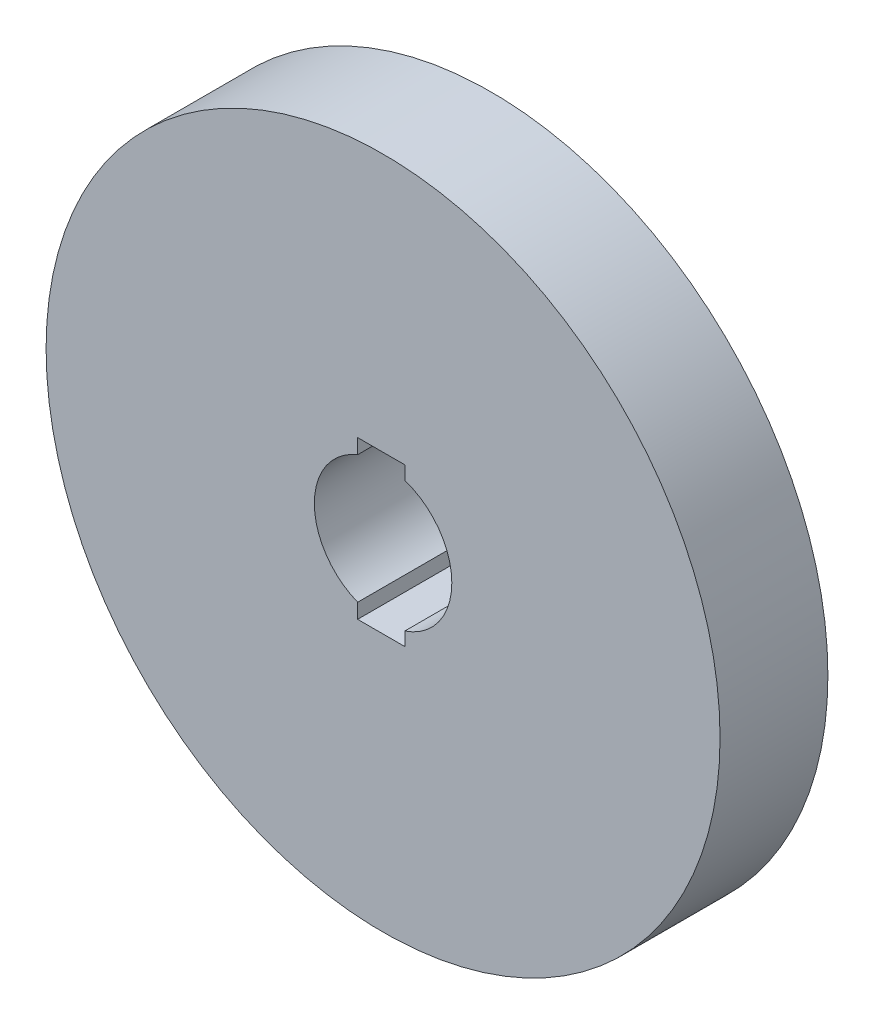
ISO-10303-21;
HEADER;
FILE_DESCRIPTION(('STEP AP214'),'2;1');
FILE_NAME('part.step','',(''),(''),'','','');
FILE_SCHEMA(('AUTOMOTIVE_DESIGN { 1 0 10303 214 1 1 1 1 }'));
ENDSEC;
DATA;
#1=APPLICATION_CONTEXT('core data for automotive mechanical design processes');
#2=APPLICATION_PROTOCOL_DEFINITION('international standard','automotive_design',2000,#1);
#3=PRODUCT_CONTEXT('',#1,'mechanical');
#4=PRODUCT('Part','Part','',(#3));
#5=PRODUCT_RELATED_PRODUCT_CATEGORY('part','',(#4));
#6=PRODUCT_DEFINITION_FORMATION('','',#4);
#7=PRODUCT_DEFINITION_CONTEXT('part definition',#1,'design');
#8=PRODUCT_DEFINITION('design','',#6,#7);
#9=PRODUCT_DEFINITION_SHAPE('','',#8);
#10=(LENGTH_UNIT() NAMED_UNIT(*) SI_UNIT(.MILLI.,.METRE.));
#11=(NAMED_UNIT(*) PLANE_ANGLE_UNIT() SI_UNIT($,.RADIAN.));
#12=(NAMED_UNIT(*) SI_UNIT($,.STERADIAN.) SOLID_ANGLE_UNIT());
#13=UNCERTAINTY_MEASURE_WITH_UNIT(LENGTH_MEASURE(1.E-05),#10,'distance_accuracy_value','');
#14=(GEOMETRIC_REPRESENTATION_CONTEXT(3) GLOBAL_UNCERTAINTY_ASSIGNED_CONTEXT((#13)) GLOBAL_UNIT_ASSIGNED_CONTEXT((#10,
#11,#12)) REPRESENTATION_CONTEXT('',''));
#15=CARTESIAN_POINT('',(0.,0.,0.));
#16=DIRECTION('',(0.,0.,1.));
#17=DIRECTION('',(1.,0.,0.));
#18=AXIS2_PLACEMENT_3D('',#15,#16,#17);
#19=CARTESIAN_POINT('',(0.,0.,8.));
#20=DIRECTION('',(0.,0.,-1.));
#21=DIRECTION('',(-1.,0.,0.));
#22=AXIS2_PLACEMENT_3D('',#19,#20,#21);
#23=CYLINDRICAL_SURFACE('',#22,25.);
#24=CARTESIAN_POINT('',(0.,0.,8.));
#25=DIRECTION('',(0.,0.,1.));
#26=DIRECTION('',(1.,0.,0.));
#27=AXIS2_PLACEMENT_3D('',#24,#25,#26);
#28=CIRCLE('',#27,25.);
#29=CARTESIAN_POINT('',(25.,0.,8.));
#30=VERTEX_POINT('',#29);
#31=EDGE_CURVE('E11',#30,#30,#28,.T.);
#32=ORIENTED_EDGE('',*,*,#31,.F.);
#33=EDGE_LOOP('',(#32));
#34=FACE_BOUND('',#33,.T.);
#35=CARTESIAN_POINT('',(0.,0.,0.));
#36=DIRECTION('',(0.,0.,1.));
#37=DIRECTION('',(1.,0.,0.));
#38=AXIS2_PLACEMENT_3D('',#35,#36,#37);
#39=CIRCLE('',#38,25.);
#40=CARTESIAN_POINT('',(25.,0.,0.));
#41=VERTEX_POINT('',#40);
#42=EDGE_CURVE('E48',#41,#41,#39,.T.);
#43=ORIENTED_EDGE('',*,*,#42,.T.);
#44=EDGE_LOOP('',(#43));
#45=FACE_BOUND('',#44,.T.);
#46=ADVANCED_FACE('F45',(#34,#45),#23,.T.);
#47=CARTESIAN_POINT('',(0.,0.,8.));
#48=DIRECTION('',(0.,0.,1.));
#49=DIRECTION('',(1.,0.,0.));
#50=AXIS2_PLACEMENT_3D('',#47,#48,#49);
#51=PLANE('',#50);
#52=DIRECTION('',(0.,1.,0.));
#53=VECTOR('',#52,1.);
#54=CARTESIAN_POINT('',(1.61259366911181,4.8383407960106,8.));
#55=LINE('',#54,#53);
#56=CARTESIAN_POINT('',(1.61259366911181,4.8383407960106,8.));
#57=VERTEX_POINT('',#56);
#58=CARTESIAN_POINT('',(1.61259366911181,5.8383407960106,8.));
#59=VERTEX_POINT('',#58);
#60=EDGE_CURVE('E60',#57,#59,#55,.T.);
#61=ORIENTED_EDGE('',*,*,#60,.F.);
#62=CARTESIAN_POINT('',(0.,0.,8.));
#63=DIRECTION('',(0.,0.,1.));
#64=DIRECTION('',(1.,0.,0.));
#65=AXIS2_PLACEMENT_3D('',#62,#63,#64);
#66=CIRCLE('',#65,5.1);
#67=CARTESIAN_POINT('',(1.61259366911181,-4.8383407960106,8.));
#68=VERTEX_POINT('',#67);
#69=EDGE_CURVE('E132',#68,#57,#66,.T.);
#70=ORIENTED_EDGE('',*,*,#69,.F.);
#71=DIRECTION('',(0.,1.,0.));
#72=VECTOR('',#71,1.);
#73=CARTESIAN_POINT('',(1.61259366911181,-5.8383407960106,8.));
#74=LINE('',#73,#72);
#75=CARTESIAN_POINT('',(1.61259366911181,-5.8383407960106,8.));
#76=VERTEX_POINT('',#75);
#77=EDGE_CURVE('E136',#76,#68,#74,.T.);
#78=ORIENTED_EDGE('',*,*,#77,.F.);
#79=DIRECTION('',(1.,0.,0.));
#80=VECTOR('',#79,1.);
#81=CARTESIAN_POINT('',(-1.88629968479603,-5.8383407960106,8.));
#82=LINE('',#81,#80);
#83=CARTESIAN_POINT('',(-1.88629968479603,-5.8383407960106,8.));
#84=VERTEX_POINT('',#83);
#85=EDGE_CURVE('E175',#84,#76,#82,.T.);
#86=ORIENTED_EDGE('',*,*,#85,.F.);
#87=DIRECTION('',(0.,-1.,0.));
#88=VECTOR('',#87,1.);
#89=CARTESIAN_POINT('',(-1.88629968479603,-5.8383407960106,8.));
#90=LINE('',#89,#88);
#91=CARTESIAN_POINT('',(-1.88629968479603,-4.7383407960106,8.));
#92=VERTEX_POINT('',#91);
#93=EDGE_CURVE('E171',#92,#84,#90,.T.);
#94=ORIENTED_EDGE('',*,*,#93,.F.);
#95=CARTESIAN_POINT('',(0.,0.,8.));
#96=DIRECTION('',(0.,0.,1.));
#97=DIRECTION('',(1.,0.,0.));
#98=AXIS2_PLACEMENT_3D('',#95,#96,#97);
#99=CIRCLE('',#98,5.1);
#100=CARTESIAN_POINT('',(-1.88629968479603,4.7383407960106,8.));
#101=VERTEX_POINT('',#100);
#102=EDGE_CURVE('E167',#101,#92,#99,.T.);
#103=ORIENTED_EDGE('',*,*,#102,.F.);
#104=DIRECTION('',(0.,-1.,0.));
#105=VECTOR('',#104,1.);
#106=CARTESIAN_POINT('',(-1.88629968479603,4.7383407960106,8.));
#107=LINE('',#106,#105);
#108=CARTESIAN_POINT('',(-1.88629968479603,5.8383407960106,8.));
#109=VERTEX_POINT('',#108);
#110=EDGE_CURVE('E163',#109,#101,#107,.T.);
#111=ORIENTED_EDGE('',*,*,#110,.F.);
#112=DIRECTION('',(-1.,0.,0.));
#113=VECTOR('',#112,1.);
#114=CARTESIAN_POINT('',(-1.88629968479603,5.8383407960106,8.));
#115=LINE('',#114,#113);
#116=EDGE_CURVE('E160',#59,#109,#115,.T.);
#117=ORIENTED_EDGE('',*,*,#116,.F.);
#118=EDGE_LOOP('',(#61,#70,#78,#86,#94,#103,#111,#117));
#119=FACE_BOUND('',#118,.T.);
#120=ORIENTED_EDGE('',*,*,#31,.T.);
#121=EDGE_LOOP('',(#120));
#122=FACE_BOUND('',#121,.T.);
#123=ADVANCED_FACE('F205',(#119,#122),#51,.T.);
#124=CARTESIAN_POINT('',(0.,0.,0.));
#125=DIRECTION('',(0.,0.,1.));
#126=DIRECTION('',(1.,0.,0.));
#127=AXIS2_PLACEMENT_3D('',#124,#125,#126);
#128=PLANE('',#127);
#129=CARTESIAN_POINT('',(0.,0.,0.));
#130=DIRECTION('',(0.,0.,1.));
#131=DIRECTION('',(1.,0.,0.));
#132=AXIS2_PLACEMENT_3D('',#129,#130,#131);
#133=CIRCLE('',#132,5.1);
#134=CARTESIAN_POINT('',(1.61259366911181,-4.8383407960106,0.));
#135=VERTEX_POINT('',#134);
#136=CARTESIAN_POINT('',(1.61259366911181,4.8383407960106,0.));
#137=VERTEX_POINT('',#136);
#138=EDGE_CURVE('E119',#135,#137,#133,.T.);
#139=ORIENTED_EDGE('',*,*,#138,.T.);
#140=DIRECTION('',(0.,1.,0.));
#141=VECTOR('',#140,1.);
#142=CARTESIAN_POINT('',(1.61259366911181,4.8383407960106,0.));
#143=LINE('',#142,#141);
#144=CARTESIAN_POINT('',(1.61259366911181,5.8383407960106,0.));
#145=VERTEX_POINT('',#144);
#146=EDGE_CURVE('E112',#137,#145,#143,.T.);
#147=ORIENTED_EDGE('',*,*,#146,.T.);
#148=DIRECTION('',(-1.,0.,0.));
#149=VECTOR('',#148,1.);
#150=CARTESIAN_POINT('',(-1.88629968479603,5.8383407960106,0.));
#151=LINE('',#150,#149);
#152=CARTESIAN_POINT('',(-1.88629968479603,5.8383407960106,0.));
#153=VERTEX_POINT('',#152);
#154=EDGE_CURVE('E122',#145,#153,#151,.T.);
#155=ORIENTED_EDGE('',*,*,#154,.T.);
#156=DIRECTION('',(0.,-1.,0.));
#157=VECTOR('',#156,1.);
#158=CARTESIAN_POINT('',(-1.88629968479603,4.7383407960106,0.));
#159=LINE('',#158,#157);
#160=CARTESIAN_POINT('',(-1.88629968479603,4.7383407960106,0.));
#161=VERTEX_POINT('',#160);
#162=EDGE_CURVE('E68',#153,#161,#159,.T.);
#163=ORIENTED_EDGE('',*,*,#162,.T.);
#164=CARTESIAN_POINT('',(0.,0.,0.));
#165=DIRECTION('',(0.,0.,1.));
#166=DIRECTION('',(1.,0.,0.));
#167=AXIS2_PLACEMENT_3D('',#164,#165,#166);
#168=CIRCLE('',#167,5.1);
#169=CARTESIAN_POINT('',(-1.88629968479603,-4.7383407960106,0.));
#170=VERTEX_POINT('',#169);
#171=EDGE_CURVE('E141',#161,#170,#168,.T.);
#172=ORIENTED_EDGE('',*,*,#171,.T.);
#173=DIRECTION('',(0.,-1.,0.));
#174=VECTOR('',#173,1.);
#175=CARTESIAN_POINT('',(-1.88629968479603,-5.8383407960106,0.));
#176=LINE('',#175,#174);
#177=CARTESIAN_POINT('',(-1.88629968479603,-5.8383407960106,0.));
#178=VERTEX_POINT('',#177);
#179=EDGE_CURVE('E145',#170,#178,#176,.T.);
#180=ORIENTED_EDGE('',*,*,#179,.T.);
#181=DIRECTION('',(1.,0.,0.));
#182=VECTOR('',#181,1.);
#183=CARTESIAN_POINT('',(-1.88629968479603,-5.8383407960106,0.));
#184=LINE('',#183,#182);
#185=CARTESIAN_POINT('',(1.61259366911181,-5.8383407960106,0.));
#186=VERTEX_POINT('',#185);
#187=EDGE_CURVE('E149',#178,#186,#184,.T.);
#188=ORIENTED_EDGE('',*,*,#187,.T.);
#189=DIRECTION('',(0.,1.,0.));
#190=VECTOR('',#189,1.);
#191=CARTESIAN_POINT('',(1.61259366911181,-5.8383407960106,0.));
#192=LINE('',#191,#190);
#193=EDGE_CURVE('E153',#186,#135,#192,.T.);
#194=ORIENTED_EDGE('',*,*,#193,.T.);
#195=EDGE_LOOP('',(#139,#147,#155,#163,#172,#180,#188,#194));
#196=FACE_BOUND('',#195,.T.);
#197=ORIENTED_EDGE('',*,*,#42,.F.);
#198=EDGE_LOOP('',(#197));
#199=FACE_BOUND('',#198,.T.);
#200=ADVANCED_FACE('F127',(#196,#199),#128,.F.);
#201=CARTESIAN_POINT('',(1.61259366911181,4.8383407960106,0.));
#202=DIRECTION('',(1.,0.,0.));
#203=DIRECTION('',(0.,0.,-1.));
#204=AXIS2_PLACEMENT_3D('',#201,#202,#203);
#205=PLANE('',#204);
#206=ORIENTED_EDGE('',*,*,#60,.T.);
#207=DIRECTION('',(0.,0.,1.));
#208=VECTOR('',#207,1.);
#209=CARTESIAN_POINT('',(1.61259366911181,5.8383407960106,0.));
#210=LINE('',#209,#208);
#211=EDGE_CURVE('E108',#145,#59,#210,.T.);
#212=ORIENTED_EDGE('',*,*,#211,.F.);
#213=ORIENTED_EDGE('',*,*,#146,.F.);
#214=DIRECTION('',(0.,0.,1.));
#215=VECTOR('',#214,1.);
#216=CARTESIAN_POINT('',(1.61259366911181,4.8383407960106,0.));
#217=LINE('',#216,#215);
#218=EDGE_CURVE('E182',#137,#57,#217,.T.);
#219=ORIENTED_EDGE('',*,*,#218,.T.);
#220=EDGE_LOOP('',(#206,#212,#213,#219));
#221=FACE_BOUND('',#220,.T.);
#222=ADVANCED_FACE('F110',(#221),#205,.F.);
#223=CARTESIAN_POINT('',(0.,0.,0.));
#224=DIRECTION('',(0.,0.,1.));
#225=DIRECTION('',(1.,0.,0.));
#226=AXIS2_PLACEMENT_3D('',#223,#224,#225);
#227=CYLINDRICAL_SURFACE('',#226,5.1);
#228=ORIENTED_EDGE('',*,*,#69,.T.);
#229=ORIENTED_EDGE('',*,*,#218,.F.);
#230=ORIENTED_EDGE('',*,*,#138,.F.);
#231=DIRECTION('',(0.,0.,1.));
#232=VECTOR('',#231,1.);
#233=CARTESIAN_POINT('',(1.61259366911181,-4.8383407960106,0.));
#234=LINE('',#233,#232);
#235=EDGE_CURVE('E185',#135,#68,#234,.T.);
#236=ORIENTED_EDGE('',*,*,#235,.T.);
#237=EDGE_LOOP('',(#228,#229,#230,#236));
#238=FACE_BOUND('',#237,.T.);
#239=ADVANCED_FACE('F224',(#238),#227,.F.);
#240=CARTESIAN_POINT('',(1.61259366911181,-5.8383407960106,0.));
#241=DIRECTION('',(1.,0.,0.));
#242=DIRECTION('',(0.,0.,-1.));
#243=AXIS2_PLACEMENT_3D('',#240,#241,#242);
#244=PLANE('',#243);
#245=ORIENTED_EDGE('',*,*,#77,.T.);
#246=ORIENTED_EDGE('',*,*,#235,.F.);
#247=ORIENTED_EDGE('',*,*,#193,.F.);
#248=DIRECTION('',(0.,0.,1.));
#249=VECTOR('',#248,1.);
#250=CARTESIAN_POINT('',(1.61259366911181,-5.8383407960106,0.));
#251=LINE('',#250,#249);
#252=EDGE_CURVE('E188',#186,#76,#251,.T.);
#253=ORIENTED_EDGE('',*,*,#252,.T.);
#254=EDGE_LOOP('',(#245,#246,#247,#253));
#255=FACE_BOUND('',#254,.T.);
#256=ADVANCED_FACE('F221',(#255),#244,.F.);
#257=CARTESIAN_POINT('',(-1.88629968479603,-5.8383407960106,0.));
#258=DIRECTION('',(0.,-1.,0.));
#259=DIRECTION('',(0.,0.,-1.));
#260=AXIS2_PLACEMENT_3D('',#257,#258,#259);
#261=PLANE('',#260);
#262=ORIENTED_EDGE('',*,*,#85,.T.);
#263=ORIENTED_EDGE('',*,*,#252,.F.);
#264=ORIENTED_EDGE('',*,*,#187,.F.);
#265=DIRECTION('',(0.,0.,1.));
#266=VECTOR('',#265,1.);
#267=CARTESIAN_POINT('',(-1.88629968479603,-5.8383407960106,0.));
#268=LINE('',#267,#266);
#269=EDGE_CURVE('E191',#178,#84,#268,.T.);
#270=ORIENTED_EDGE('',*,*,#269,.T.);
#271=EDGE_LOOP('',(#262,#263,#264,#270));
#272=FACE_BOUND('',#271,.T.);
#273=ADVANCED_FACE('F217',(#272),#261,.F.);
#274=CARTESIAN_POINT('',(-1.88629968479603,-5.8383407960106,0.));
#275=DIRECTION('',(-1.,0.,0.));
#276=DIRECTION('',(0.,0.,1.));
#277=AXIS2_PLACEMENT_3D('',#274,#275,#276);
#278=PLANE('',#277);
#279=ORIENTED_EDGE('',*,*,#93,.T.);
#280=ORIENTED_EDGE('',*,*,#269,.F.);
#281=ORIENTED_EDGE('',*,*,#179,.F.);
#282=DIRECTION('',(0.,0.,1.));
#283=VECTOR('',#282,1.);
#284=CARTESIAN_POINT('',(-1.88629968479603,-4.7383407960106,0.));
#285=LINE('',#284,#283);
#286=EDGE_CURVE('E194',#170,#92,#285,.T.);
#287=ORIENTED_EDGE('',*,*,#286,.T.);
#288=EDGE_LOOP('',(#279,#280,#281,#287));
#289=FACE_BOUND('',#288,.T.);
#290=ADVANCED_FACE('F215',(#289),#278,.F.);
#291=CARTESIAN_POINT('',(0.,0.,0.));
#292=DIRECTION('',(0.,0.,1.));
#293=DIRECTION('',(1.,0.,0.));
#294=AXIS2_PLACEMENT_3D('',#291,#292,#293);
#295=CYLINDRICAL_SURFACE('',#294,5.1);
#296=ORIENTED_EDGE('',*,*,#102,.T.);
#297=ORIENTED_EDGE('',*,*,#286,.F.);
#298=ORIENTED_EDGE('',*,*,#171,.F.);
#299=DIRECTION('',(0.,0.,1.));
#300=VECTOR('',#299,1.);
#301=CARTESIAN_POINT('',(-1.88629968479603,4.7383407960106,0.));
#302=LINE('',#301,#300);
#303=EDGE_CURVE('E197',#161,#101,#302,.T.);
#304=ORIENTED_EDGE('',*,*,#303,.T.);
#305=EDGE_LOOP('',(#296,#297,#298,#304));
#306=FACE_BOUND('',#305,.T.);
#307=ADVANCED_FACE('F210',(#306),#295,.F.);
#308=CARTESIAN_POINT('',(-1.88629968479603,4.7383407960106,0.));
#309=DIRECTION('',(-1.,0.,0.));
#310=DIRECTION('',(0.,0.,1.));
#311=AXIS2_PLACEMENT_3D('',#308,#309,#310);
#312=PLANE('',#311);
#313=ORIENTED_EDGE('',*,*,#110,.T.);
#314=ORIENTED_EDGE('',*,*,#303,.F.);
#315=ORIENTED_EDGE('',*,*,#162,.F.);
#316=DIRECTION('',(0.,0.,1.));
#317=VECTOR('',#316,1.);
#318=CARTESIAN_POINT('',(-1.88629968479603,5.8383407960106,0.));
#319=LINE('',#318,#317);
#320=EDGE_CURVE('E118',#153,#109,#319,.T.);
#321=ORIENTED_EDGE('',*,*,#320,.T.);
#322=EDGE_LOOP('',(#313,#314,#315,#321));
#323=FACE_BOUND('',#322,.T.);
#324=ADVANCED_FACE('F201',(#323),#312,.F.);
#325=CARTESIAN_POINT('',(-1.88629968479603,5.8383407960106,0.));
#326=DIRECTION('',(0.,1.,0.));
#327=DIRECTION('',(0.,0.,1.));
#328=AXIS2_PLACEMENT_3D('',#325,#326,#327);
#329=PLANE('',#328);
#330=ORIENTED_EDGE('',*,*,#116,.T.);
#331=ORIENTED_EDGE('',*,*,#320,.F.);
#332=ORIENTED_EDGE('',*,*,#154,.F.);
#333=ORIENTED_EDGE('',*,*,#211,.T.);
#334=EDGE_LOOP('',(#330,#331,#332,#333));
#335=FACE_BOUND('',#334,.T.);
#336=ADVANCED_FACE('F123',(#335),#329,.F.);
#337=CLOSED_SHELL('',(#46,#123,#200,#222,#239,#256,#273,#290,#307,#324,#336));
#338=MANIFOLD_SOLID_BREP('B2',#337);
#339=ADVANCED_BREP_SHAPE_REPRESENTATION('',(#18,#338),#14);
#340=SHAPE_DEFINITION_REPRESENTATION(#9,#339);
ENDSEC;
END-ISO-10303-21;
